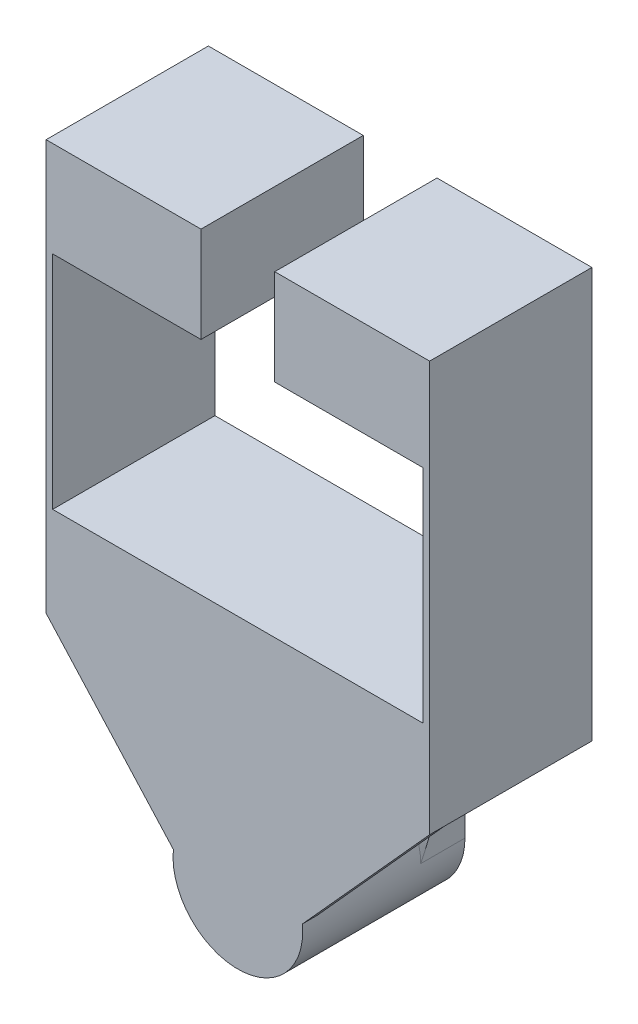
ISO-10303-21;
HEADER;
FILE_DESCRIPTION(('STEP AP214'),'2;1');
FILE_NAME('part.step','',(''),(''),'','','');
FILE_SCHEMA(('AUTOMOTIVE_DESIGN { 1 0 10303 214 1 1 1 1 }'));
ENDSEC;
DATA;
#1=APPLICATION_CONTEXT('core data for automotive mechanical design processes');
#2=APPLICATION_PROTOCOL_DEFINITION('international standard','automotive_design',2000,#1);
#3=PRODUCT_CONTEXT('',#1,'mechanical');
#4=PRODUCT('Part','Part','',(#3));
#5=PRODUCT_RELATED_PRODUCT_CATEGORY('part','',(#4));
#6=PRODUCT_DEFINITION_FORMATION('','',#4);
#7=PRODUCT_DEFINITION_CONTEXT('part definition',#1,'design');
#8=PRODUCT_DEFINITION('design','',#6,#7);
#9=PRODUCT_DEFINITION_SHAPE('','',#8);
#10=(LENGTH_UNIT() NAMED_UNIT(*) SI_UNIT(.MILLI.,.METRE.));
#11=(NAMED_UNIT(*) PLANE_ANGLE_UNIT() SI_UNIT($,.RADIAN.));
#12=(NAMED_UNIT(*) SI_UNIT($,.STERADIAN.) SOLID_ANGLE_UNIT());
#13=UNCERTAINTY_MEASURE_WITH_UNIT(LENGTH_MEASURE(1.E-05),#10,'distance_accuracy_value','');
#14=(GEOMETRIC_REPRESENTATION_CONTEXT(3) GLOBAL_UNCERTAINTY_ASSIGNED_CONTEXT((#13)) GLOBAL_UNIT_ASSIGNED_CONTEXT((#10,
#11,#12)) REPRESENTATION_CONTEXT('',''));
#15=CARTESIAN_POINT('',(0.,0.,0.));
#16=DIRECTION('',(0.,0.,1.));
#17=DIRECTION('',(1.,0.,0.));
#18=AXIS2_PLACEMENT_3D('',#15,#16,#17);
#19=CARTESIAN_POINT('',(0.,25.4,0.));
#20=DIRECTION('',(0.,-1.,0.));
#21=DIRECTION('',(0.,0.,-1.));
#22=AXIS2_PLACEMENT_3D('',#19,#20,#21);
#23=PLANE('',#22);
#24=DIRECTION('',(0.,0.,-1.));
#25=VECTOR('',#24,1.);
#26=CARTESIAN_POINT('',(33.02,25.4,0.));
#27=LINE('',#26,#25);
#28=CARTESIAN_POINT('',(33.02,25.4,-2.54));
#29=VERTEX_POINT('',#28);
#30=CARTESIAN_POINT('',(33.02,25.4,-27.94));
#31=VERTEX_POINT('',#30);
#32=EDGE_CURVE('E234',#29,#31,#27,.T.);
#33=ORIENTED_EDGE('',*,*,#32,.F.);
#34=DIRECTION('',(-1.,0.,0.));
#35=VECTOR('',#34,1.);
#36=CARTESIAN_POINT('',(33.02,25.4,-2.54));
#37=LINE('',#36,#35);
#38=CARTESIAN_POINT('',(-33.02,25.4,-2.54));
#39=VERTEX_POINT('',#38);
#40=EDGE_CURVE('E223',#29,#39,#37,.T.);
#41=ORIENTED_EDGE('',*,*,#40,.T.);
#42=DIRECTION('',(0.,0.,1.));
#43=VECTOR('',#42,1.);
#44=CARTESIAN_POINT('',(-33.02,25.4,0.));
#45=LINE('',#44,#43);
#46=CARTESIAN_POINT('',(-33.02,25.4,-27.94));
#47=VERTEX_POINT('',#46);
#48=EDGE_CURVE('E231',#47,#39,#45,.T.);
#49=ORIENTED_EDGE('',*,*,#48,.F.);
#50=DIRECTION('',(-1.,0.,0.));
#51=VECTOR('',#50,1.);
#52=CARTESIAN_POINT('',(-11.1628049548617,25.4,-27.94));
#53=LINE('',#52,#51);
#54=CARTESIAN_POINT('',(-11.1628049548617,25.4,-27.94));
#55=VERTEX_POINT('',#54);
#56=EDGE_CURVE('E413',#55,#47,#53,.T.);
#57=ORIENTED_EDGE('',*,*,#56,.F.);
#58=DIRECTION('',(0.,0.,-1.));
#59=VECTOR('',#58,1.);
#60=CARTESIAN_POINT('',(-11.1628049548617,25.4,-22.86));
#61=LINE('',#60,#59);
#62=CARTESIAN_POINT('',(-11.1628049548617,25.4,-13.97));
#63=VERTEX_POINT('',#62);
#64=EDGE_CURVE('E280',#63,#55,#61,.T.);
#65=ORIENTED_EDGE('',*,*,#64,.F.);
#66=DIRECTION('',(1.,0.,0.));
#67=VECTOR('',#66,1.);
#68=CARTESIAN_POINT('',(-33.02,25.4,-13.97));
#69=LINE('',#68,#67);
#70=CARTESIAN_POINT('',(11.1628049548617,25.4,-13.97));
#71=VERTEX_POINT('',#70);
#72=EDGE_CURVE('E393',#63,#71,#69,.T.);
#73=ORIENTED_EDGE('',*,*,#72,.T.);
#74=DIRECTION('',(0.,0.,-1.));
#75=VECTOR('',#74,1.);
#76=CARTESIAN_POINT('',(11.1628049548617,25.4,-22.86));
#77=LINE('',#76,#75);
#78=CARTESIAN_POINT('',(11.1628049548617,25.4,-27.94));
#79=VERTEX_POINT('',#78);
#80=EDGE_CURVE('E277',#71,#79,#77,.T.);
#81=ORIENTED_EDGE('',*,*,#80,.T.);
#82=DIRECTION('',(-1.,0.,0.));
#83=VECTOR('',#82,1.);
#84=CARTESIAN_POINT('',(33.02,25.4,-27.94));
#85=LINE('',#84,#83);
#86=EDGE_CURVE('E458',#31,#79,#85,.T.);
#87=ORIENTED_EDGE('',*,*,#86,.F.);
#88=EDGE_LOOP('',(#33,#41,#49,#57,#65,#73,#81,#87));
#89=FACE_BOUND('',#88,.T.);
#90=ADVANCED_FACE('F47',(#89),#23,.T.);
#91=CARTESIAN_POINT('',(0.,0.,-22.86));
#92=DIRECTION('',(0.,0.,-1.));
#93=DIRECTION('',(-1.,0.,0.));
#94=AXIS2_PLACEMENT_3D('',#91,#92,#93);
#95=PLANE('',#94);
#96=CARTESIAN_POINT('',(0.,0.,-22.86));
#97=DIRECTION('',(0.,0.,-1.));
#98=DIRECTION('',(-1.,0.,0.));
#99=AXIS2_PLACEMENT_3D('',#96,#97,#98);
#100=CIRCLE('',#99,13.7028049548617);
#101=CARTESIAN_POINT('',(-11.1628049548617,7.94724160767102,-22.86));
#102=VERTEX_POINT('',#101);
#103=CARTESIAN_POINT('',(-6.79504801211464,11.8993355337195,-22.86));
#104=VERTEX_POINT('',#103);
#105=EDGE_CURVE('E304',#102,#104,#100,.T.);
#106=ORIENTED_EDGE('',*,*,#105,.T.);
#107=DIRECTION('',(1.,0.,0.));
#108=VECTOR('',#107,1.);
#109=CARTESIAN_POINT('',(0.,11.8993355337195,-22.86));
#110=LINE('',#109,#108);
#111=CARTESIAN_POINT('',(-11.1628049548617,11.8993355337195,-22.86));
#112=VERTEX_POINT('',#111);
#113=EDGE_CURVE('E307',#104,#112,#110,.F.);
#114=ORIENTED_EDGE('',*,*,#113,.T.);
#115=DIRECTION('',(0.,1.,0.));
#116=VECTOR('',#115,1.);
#117=CARTESIAN_POINT('',(-11.1628049548617,25.4,-22.86));
#118=LINE('',#117,#116);
#119=EDGE_CURVE('E264',#102,#112,#118,.T.);
#120=ORIENTED_EDGE('',*,*,#119,.F.);
#121=EDGE_LOOP('',(#106,#114,#120));
#122=FACE_BOUND('',#121,.T.);
#123=ADVANCED_FACE('F356',(#122),#95,.F.);
#124=CARTESIAN_POINT('',(-33.02,41.4643705136554,0.));
#125=DIRECTION('',(1.,0.,0.));
#126=DIRECTION('',(0.,0.,-1.));
#127=AXIS2_PLACEMENT_3D('',#124,#125,#126);
#128=PLANE('',#127);
#129=ORIENTED_EDGE('',*,*,#48,.T.);
#130=DIRECTION('',(0.,0.,1.));
#131=VECTOR('',#130,1.);
#132=CARTESIAN_POINT('',(-33.02,25.4,-2.54));
#133=LINE('',#132,#131);
#134=CARTESIAN_POINT('',(-33.02,25.4,0.));
#135=VERTEX_POINT('',#134);
#136=EDGE_CURVE('E210',#39,#135,#133,.T.);
#137=ORIENTED_EDGE('',*,*,#136,.T.);
#138=DIRECTION('',(0.,-1.,0.));
#139=VECTOR('',#138,1.);
#140=CARTESIAN_POINT('',(-33.02,41.4643705136554,0.));
#141=LINE('',#140,#139);
#142=CARTESIAN_POINT('',(-33.02,96.0254518876114,0.));
#143=VERTEX_POINT('',#142);
#144=EDGE_CURVE('E261',#143,#135,#141,.T.);
#145=ORIENTED_EDGE('',*,*,#144,.F.);
#146=DIRECTION('',(0.,0.,1.));
#147=VECTOR('',#146,1.);
#148=CARTESIAN_POINT('',(-33.02,96.0254518876114,0.));
#149=LINE('',#148,#147);
#150=CARTESIAN_POINT('',(-33.02,96.0254518876114,-27.94));
#151=VERTEX_POINT('',#150);
#152=EDGE_CURVE('E470',#151,#143,#149,.T.);
#153=ORIENTED_EDGE('',*,*,#152,.F.);
#154=DIRECTION('',(0.,1.,0.));
#155=VECTOR('',#154,1.);
#156=CARTESIAN_POINT('',(-33.02,25.4,-27.94));
#157=LINE('',#156,#155);
#158=EDGE_CURVE('E242',#47,#151,#157,.T.);
#159=ORIENTED_EDGE('',*,*,#158,.F.);
#160=EDGE_LOOP('',(#129,#137,#145,#153,#159));
#161=FACE_BOUND('',#160,.T.);
#162=ADVANCED_FACE('F240',(#161),#128,.F.);
#163=CARTESIAN_POINT('',(0.,41.4643705136554,0.));
#164=DIRECTION('',(0.,-1.,0.));
#165=DIRECTION('',(0.,0.,-1.));
#166=AXIS2_PLACEMENT_3D('',#163,#164,#165);
#167=PLANE('',#166);
#168=DIRECTION('',(0.,0.,1.));
#169=VECTOR('',#168,1.);
#170=CARTESIAN_POINT('',(31.8903580164554,41.4643705136554,-25.4));
#171=LINE('',#170,#169);
#172=CARTESIAN_POINT('',(31.8903580164554,41.4643705136554,-27.94));
#173=VERTEX_POINT('',#172);
#174=CARTESIAN_POINT('',(31.8903580164554,41.4643705136554,0.));
#175=VERTEX_POINT('',#174);
#176=EDGE_CURVE('E513',#173,#175,#171,.T.);
#177=ORIENTED_EDGE('',*,*,#176,.F.);
#178=DIRECTION('',(1.,0.,0.));
#179=VECTOR('',#178,1.);
#180=CARTESIAN_POINT('',(-31.8903580164554,41.4643705136554,-27.94));
#181=LINE('',#180,#179);
#182=CARTESIAN_POINT('',(-31.8903580164554,41.4643705136554,-27.94));
#183=VERTEX_POINT('',#182);
#184=EDGE_CURVE('E434',#183,#173,#181,.T.);
#185=ORIENTED_EDGE('',*,*,#184,.F.);
#186=DIRECTION('',(0.,0.,-1.));
#187=VECTOR('',#186,1.);
#188=CARTESIAN_POINT('',(-31.8903580164554,41.4643705136554,-25.4));
#189=LINE('',#188,#187);
#190=CARTESIAN_POINT('',(-31.8903580164554,41.4643705136554,0.));
#191=VERTEX_POINT('',#190);
#192=EDGE_CURVE('E517',#191,#183,#189,.T.);
#193=ORIENTED_EDGE('',*,*,#192,.F.);
#194=DIRECTION('',(1.,0.,0.));
#195=VECTOR('',#194,1.);
#196=CARTESIAN_POINT('',(-33.02,41.4643705136554,0.));
#197=LINE('',#196,#195);
#198=EDGE_CURVE('E254',#191,#175,#197,.T.);
#199=ORIENTED_EDGE('',*,*,#198,.T.);
#200=EDGE_LOOP('',(#177,#185,#193,#199));
#201=FACE_BOUND('',#200,.T.);
#202=ADVANCED_FACE('F346',(#201),#167,.F.);
#203=CARTESIAN_POINT('',(0.,0.,-25.4));
#204=DIRECTION('',(0.,0.,1.));
#205=DIRECTION('',(1.,0.,0.));
#206=AXIS2_PLACEMENT_3D('',#203,#204,#205);
#207=CYLINDRICAL_SURFACE('',#206,11.1628049548617);
#208=DIRECTION('',(0.,0.,1.));
#209=VECTOR('',#208,1.);
#210=CARTESIAN_POINT('',(11.1050792058228,1.13376818295749,-2.54));
#211=LINE('',#210,#209);
#212=CARTESIAN_POINT('',(11.1050792058228,1.13376818295749,-2.54));
#213=VERTEX_POINT('',#212);
#214=CARTESIAN_POINT('',(11.1050792058228,1.13376818295749,0.));
#215=VERTEX_POINT('',#214);
#216=EDGE_CURVE('E399',#213,#215,#211,.T.);
#217=ORIENTED_EDGE('',*,*,#216,.T.);
#218=CARTESIAN_POINT('',(0.,0.,0.));
#219=DIRECTION('',(0.,0.,1.));
#220=DIRECTION('',(1.,0.,0.));
#221=AXIS2_PLACEMENT_3D('',#218,#219,#220);
#222=CIRCLE('',#221,11.1628049548617);
#223=CARTESIAN_POINT('',(-11.1050792058228,1.13376818295749,0.));
#224=VERTEX_POINT('',#223);
#225=EDGE_CURVE('E276',#224,#215,#222,.T.);
#226=ORIENTED_EDGE('',*,*,#225,.F.);
#227=DIRECTION('',(0.,0.,1.));
#228=VECTOR('',#227,1.);
#229=CARTESIAN_POINT('',(-11.1050792058228,1.1337681829575,-2.54));
#230=LINE('',#229,#228);
#231=CARTESIAN_POINT('',(-11.1050792058228,1.1337681829575,-2.54));
#232=VERTEX_POINT('',#231);
#233=EDGE_CURVE('E218',#232,#224,#230,.T.);
#234=ORIENTED_EDGE('',*,*,#233,.F.);
#235=CARTESIAN_POINT('',(0.,0.,-2.54));
#236=DIRECTION('',(0.,0.,1.));
#237=DIRECTION('',(1.,0.,0.));
#238=AXIS2_PLACEMENT_3D('',#235,#236,#237);
#239=CIRCLE('',#238,11.1628049548617);
#240=EDGE_CURVE('E226',#232,#213,#239,.F.);
#241=ORIENTED_EDGE('',*,*,#240,.T.);
#242=EDGE_LOOP('',(#217,#226,#234,#241));
#243=FACE_BOUND('',#242,.T.);
#244=CARTESIAN_POINT('',(0.,0.,-20.32));
#245=DIRECTION('',(0.,0.,-1.));
#246=DIRECTION('',(-1.,0.,0.));
#247=AXIS2_PLACEMENT_3D('',#244,#245,#246);
#248=CIRCLE('',#247,11.1628049548617);
#249=CARTESIAN_POINT('',(11.1628049548617,0.,-20.32));
#250=VERTEX_POINT('',#249);
#251=CARTESIAN_POINT('',(-11.1628049548617,0.,-20.32));
#252=VERTEX_POINT('',#251);
#253=EDGE_CURVE('E310',#250,#252,#248,.F.);
#254=ORIENTED_EDGE('',*,*,#253,.T.);
#255=DIRECTION('',(0.,0.,-1.));
#256=VECTOR('',#255,1.);
#257=CARTESIAN_POINT('',(-11.1628049548617,0.,-22.86));
#258=LINE('',#257,#256);
#259=CARTESIAN_POINT('',(-11.1628049548617,0.,-27.94));
#260=VERTEX_POINT('',#259);
#261=EDGE_CURVE('E272',#252,#260,#258,.T.);
#262=ORIENTED_EDGE('',*,*,#261,.T.);
#263=CARTESIAN_POINT('',(0.,0.,-27.94));
#264=DIRECTION('',(0.,0.,-1.));
#265=DIRECTION('',(-1.,0.,0.));
#266=AXIS2_PLACEMENT_3D('',#263,#264,#265);
#267=CIRCLE('',#266,11.1628049548617);
#268=CARTESIAN_POINT('',(11.1628049548617,0.,-27.94));
#269=VERTEX_POINT('',#268);
#270=EDGE_CURVE('E397',#269,#260,#267,.T.);
#271=ORIENTED_EDGE('',*,*,#270,.F.);
#272=DIRECTION('',(0.,0.,-1.));
#273=VECTOR('',#272,1.);
#274=CARTESIAN_POINT('',(11.1628049548617,0.,-22.86));
#275=LINE('',#274,#273);
#276=EDGE_CURVE('E273',#250,#269,#275,.T.);
#277=ORIENTED_EDGE('',*,*,#276,.F.);
#278=EDGE_LOOP('',(#254,#262,#271,#277));
#279=FACE_BOUND('',#278,.T.);
#280=ADVANCED_FACE('F343',(#243,#279),#207,.T.);
#281=CARTESIAN_POINT('',(0.,0.,0.));
#282=DIRECTION('',(0.,0.,1.));
#283=DIRECTION('',(1.,0.,0.));
#284=AXIS2_PLACEMENT_3D('',#281,#282,#283);
#285=PLANE('',#284);
#286=ORIENTED_EDGE('',*,*,#225,.T.);
#287=DIRECTION('',(0.670236300369095,0.742147762691197,0.));
#288=VECTOR('',#287,1.);
#289=CARTESIAN_POINT('',(11.1050792058228,1.13376818295749,0.));
#290=LINE('',#289,#288);
#291=CARTESIAN_POINT('',(33.02,25.4,0.));
#292=VERTEX_POINT('',#291);
#293=EDGE_CURVE('E237',#215,#292,#290,.T.);
#294=ORIENTED_EDGE('',*,*,#293,.T.);
#295=DIRECTION('',(0.,-1.,0.));
#296=VECTOR('',#295,1.);
#297=CARTESIAN_POINT('',(33.02,41.4643705136554,0.));
#298=LINE('',#297,#296);
#299=CARTESIAN_POINT('',(33.02,96.0254518876114,0.));
#300=VERTEX_POINT('',#299);
#301=EDGE_CURVE('E257',#300,#292,#298,.T.);
#302=ORIENTED_EDGE('',*,*,#301,.F.);
#303=DIRECTION('',(1.,0.,0.));
#304=VECTOR('',#303,1.);
#305=CARTESIAN_POINT('',(33.02,96.0254518876114,0.));
#306=LINE('',#305,#304);
#307=CARTESIAN_POINT('',(6.34999999999999,96.0254518876114,0.));
#308=VERTEX_POINT('',#307);
#309=EDGE_CURVE('E495',#308,#300,#306,.T.);
#310=ORIENTED_EDGE('',*,*,#309,.F.);
#311=DIRECTION('',(0.,-1.,0.));
#312=VECTOR('',#311,1.);
#313=CARTESIAN_POINT('',(6.34999999999999,96.0254518876114,0.));
#314=LINE('',#313,#312);
#315=CARTESIAN_POINT('',(6.34999999999999,79.5643705136554,0.));
#316=VERTEX_POINT('',#315);
#317=EDGE_CURVE('E499',#308,#316,#314,.T.);
#318=ORIENTED_EDGE('',*,*,#317,.T.);
#319=DIRECTION('',(1.,0.,0.));
#320=VECTOR('',#319,1.);
#321=CARTESIAN_POINT('',(33.02,79.5643705136554,0.));
#322=LINE('',#321,#320);
#323=CARTESIAN_POINT('',(31.8903580164554,79.5643705136554,0.));
#324=VERTEX_POINT('',#323);
#325=EDGE_CURVE('E492',#316,#324,#322,.T.);
#326=ORIENTED_EDGE('',*,*,#325,.T.);
#327=DIRECTION('',(0.,-1.,0.));
#328=VECTOR('',#327,1.);
#329=CARTESIAN_POINT('',(31.8903580164554,79.5643705136554,0.));
#330=LINE('',#329,#328);
#331=EDGE_CURVE('E508',#324,#175,#330,.T.);
#332=ORIENTED_EDGE('',*,*,#331,.T.);
#333=ORIENTED_EDGE('',*,*,#198,.F.);
#334=DIRECTION('',(0.,-1.,0.));
#335=VECTOR('',#334,1.);
#336=CARTESIAN_POINT('',(-31.8903580164554,79.5643705136554,0.));
#337=LINE('',#336,#335);
#338=CARTESIAN_POINT('',(-31.8903580164554,79.5643705136554,0.));
#339=VERTEX_POINT('',#338);
#340=EDGE_CURVE('E244',#339,#191,#337,.T.);
#341=ORIENTED_EDGE('',*,*,#340,.F.);
#342=DIRECTION('',(1.,0.,0.));
#343=VECTOR('',#342,1.);
#344=CARTESIAN_POINT('',(-33.02,79.5643705136554,0.));
#345=LINE('',#344,#343);
#346=CARTESIAN_POINT('',(-6.34999999999999,79.5643705136554,0.));
#347=VERTEX_POINT('',#346);
#348=EDGE_CURVE('E474',#339,#347,#345,.T.);
#349=ORIENTED_EDGE('',*,*,#348,.T.);
#350=DIRECTION('',(0.,-1.,0.));
#351=VECTOR('',#350,1.);
#352=CARTESIAN_POINT('',(-6.34999999999999,96.0254518876114,0.));
#353=LINE('',#352,#351);
#354=CARTESIAN_POINT('',(-6.34999999999999,96.0254518876114,0.));
#355=VERTEX_POINT('',#354);
#356=EDGE_CURVE('E466',#355,#347,#353,.T.);
#357=ORIENTED_EDGE('',*,*,#356,.F.);
#358=DIRECTION('',(1.,0.,0.));
#359=VECTOR('',#358,1.);
#360=CARTESIAN_POINT('',(-33.02,96.0254518876114,0.));
#361=LINE('',#360,#359);
#362=EDGE_CURVE('E475',#143,#355,#361,.T.);
#363=ORIENTED_EDGE('',*,*,#362,.F.);
#364=ORIENTED_EDGE('',*,*,#144,.T.);
#365=DIRECTION('',(0.670236300369095,-0.742147762691196,0.));
#366=VECTOR('',#365,1.);
#367=CARTESIAN_POINT('',(-33.02,25.4,0.));
#368=LINE('',#367,#366);
#369=EDGE_CURVE('E69',#135,#224,#368,.T.);
#370=ORIENTED_EDGE('',*,*,#369,.T.);
#371=EDGE_LOOP('',(#286,#294,#302,#310,#318,#326,#332,#333,#341,#349,#357,#363,#364,#370));
#372=FACE_BOUND('',#371,.T.);
#373=ADVANCED_FACE('F345',(#372),#285,.T.);
#374=CARTESIAN_POINT('',(11.1628049548617,0.,-22.86));
#375=DIRECTION('',(1.,0.,0.));
#376=DIRECTION('',(0.,1.,0.));
#377=AXIS2_PLACEMENT_3D('',#374,#375,#376);
#378=PLANE('',#377);
#379=ORIENTED_EDGE('',*,*,#276,.T.);
#380=DIRECTION('',(0.,-1.,0.));
#381=VECTOR('',#380,1.);
#382=CARTESIAN_POINT('',(11.1628049548617,25.4,-27.94));
#383=LINE('',#382,#381);
#384=EDGE_CURVE('E462',#79,#269,#383,.T.);
#385=ORIENTED_EDGE('',*,*,#384,.F.);
#386=ORIENTED_EDGE('',*,*,#80,.F.);
#387=DIRECTION('',(0.,-0.819231920519041,-0.573462344363328));
#388=VECTOR('',#387,1.);
#389=CARTESIAN_POINT('',(11.1628049548617,25.4,-13.97));
#390=LINE('',#389,#388);
#391=CARTESIAN_POINT('',(11.1628049548617,13.3559298884023,-22.4008490781184));
#392=VERTEX_POINT('',#391);
#393=EDGE_CURVE('E287',#71,#392,#390,.T.);
#394=ORIENTED_EDGE('',*,*,#393,.T.);
#395=CARTESIAN_POINT('',(11.1628049548617,11.8993355337195,-20.32));
#396=DIRECTION('',(1.,0.,0.));
#397=DIRECTION('',(0.,1.,0.));
#398=AXIS2_PLACEMENT_3D('',#395,#396,#397);
#399=CIRCLE('',#398,2.54);
#400=CARTESIAN_POINT('',(11.1628049548617,11.8993355337195,-22.86));
#401=VERTEX_POINT('',#400);
#402=EDGE_CURVE('E314',#392,#401,#399,.F.);
#403=ORIENTED_EDGE('',*,*,#402,.T.);
#404=DIRECTION('',(0.,-1.,0.));
#405=VECTOR('',#404,1.);
#406=CARTESIAN_POINT('',(11.1628049548617,0.,-22.86));
#407=LINE('',#406,#405);
#408=CARTESIAN_POINT('',(11.1628049548617,7.94724160767102,-22.86));
#409=VERTEX_POINT('',#408);
#410=EDGE_CURVE('E268',#401,#409,#407,.T.);
#411=ORIENTED_EDGE('',*,*,#410,.T.);
#412=CARTESIAN_POINT('',(11.1628049548617,7.94724160767102,-22.86));
#413=CARTESIAN_POINT('',(11.1628049548617,7.80382728075797,-22.8599843683913));
#414=CARTESIAN_POINT('',(11.1628049548617,7.66045711121722,-22.8559154067964));
#415=CARTESIAN_POINT('',(11.1628049548617,7.374189907598,-22.8404396048927));
#416=CARTESIAN_POINT('',(11.1628049548617,7.23129264831364,-22.8290369984348));
#417=CARTESIAN_POINT('',(11.1628049548617,6.94660398988748,-22.799703566714));
#418=CARTESIAN_POINT('',(11.1628049548617,6.80481058426645,-22.7817917990212));
#419=CARTESIAN_POINT('',(11.1628049548617,6.52207951337565,-22.7400890787699));
#420=CARTESIAN_POINT('',(11.1628049548617,6.38114198769657,-22.7162971922434));
#421=CARTESIAN_POINT('',(11.1628049548617,5.96327763477642,-22.6376625928827));
#422=CARTESIAN_POINT('',(11.1628049548617,5.68777633607782,-22.5751665055497));
#423=CARTESIAN_POINT('',(11.1628049548617,5.1409442882879,-22.4335544124404));
#424=CARTESIAN_POINT('',(11.1628049548617,4.86961729830888,-22.3544242711608));
#425=CARTESIAN_POINT('',(11.1628049548617,4.20575637726897,-22.1429551839701));
#426=CARTESIAN_POINT('',(11.1628049548617,3.81566212496473,-22.0030048054641));
#427=CARTESIAN_POINT('',(11.1628049548617,3.04328881541315,-21.703390763083));
#428=CARTESIAN_POINT('',(11.1628049548617,2.6610101188809,-21.5437261917128));
#429=CARTESIAN_POINT('',(11.1628049548617,1.51983320538655,-21.0449283894831));
#430=CARTESIAN_POINT('',(11.1628049548616,0.769317138766279,-20.6869738266354));
#431=CARTESIAN_POINT('',(11.1628049548617,0.0127147230288613,-20.3260650733986));
#432=CARTESIAN_POINT('',(11.1628049548617,0.00635735509335308,-20.3230325262451));
#433=CARTESIAN_POINT('',(11.1628049548617,0.,-20.32));
#434=B_SPLINE_CURVE_WITH_KNOTS('',3,(#412,#413,#414,#415,#416,#417,#418,#419,#420,#421,#422,
#423,#424,#425,#426,#427,#428,#429,#430,#431,#432,#433),.UNSPECIFIED.,.F.,.F.,(4,2,2,2,2,2,2,2,
2,2,4),(0.,0.430121960835827,0.859995826814775,1.2886211134076,1.71731452444488,
2.56409625718893,3.41160050938489,4.65405351827766,5.89656374183366,8.39024598854829,
8.41137682379432),.UNSPECIFIED.);
#435=EDGE_CURVE('E11',#409,#250,#434,.T.);
#436=ORIENTED_EDGE('',*,*,#435,.T.);
#437=EDGE_LOOP('',(#379,#385,#386,#394,#403,#411,#436));
#438=FACE_BOUND('',#437,.T.);
#439=ADVANCED_FACE('F349',(#438),#378,.T.);
#440=CARTESIAN_POINT('',(-11.1628049548617,25.4,-22.86));
#441=DIRECTION('',(-1.,0.,0.));
#442=DIRECTION('',(0.,0.,1.));
#443=AXIS2_PLACEMENT_3D('',#440,#441,#442);
#444=PLANE('',#443);
#445=ORIENTED_EDGE('',*,*,#64,.T.);
#446=DIRECTION('',(0.,1.,0.));
#447=VECTOR('',#446,1.);
#448=CARTESIAN_POINT('',(-11.1628049548617,0.,-27.94));
#449=LINE('',#448,#447);
#450=EDGE_CURVE('E409',#260,#55,#449,.T.);
#451=ORIENTED_EDGE('',*,*,#450,.F.);
#452=ORIENTED_EDGE('',*,*,#261,.F.);
#453=CARTESIAN_POINT('',(-11.1628049548617,7.94724160767102,-22.86));
#454=CARTESIAN_POINT('',(-11.1628049548617,7.80382728075855,-22.8599843683913));
#455=CARTESIAN_POINT('',(-11.1628049548617,7.66045711121839,-22.8559154067964));
#456=CARTESIAN_POINT('',(-11.1628049548617,7.37418990760035,-22.8404396048929));
#457=CARTESIAN_POINT('',(-11.1628049548617,7.23129264831658,-22.829036998435));
#458=CARTESIAN_POINT('',(-11.1628049548617,6.94660398989145,-22.7997035667144));
#459=CARTESIAN_POINT('',(-11.1628049548617,6.80481058427088,-22.7817917990218));
#460=CARTESIAN_POINT('',(-11.1628049548617,6.52207951338097,-22.7400890787707));
#461=CARTESIAN_POINT('',(-11.1628049548617,6.38114198770233,-22.7162971922444));
#462=CARTESIAN_POINT('',(-11.1628049548617,5.96327763478148,-22.6376625928838));
#463=CARTESIAN_POINT('',(-11.1628049548617,5.68777633608175,-22.5751665055507));
#464=CARTESIAN_POINT('',(-11.1628049548617,5.1409442882898,-22.4335544124409));
#465=CARTESIAN_POINT('',(-11.1628049548617,4.86961729830987,-22.3544242711609));
#466=CARTESIAN_POINT('',(-11.1628049548617,4.20575637726872,-22.1429551839702));
#467=CARTESIAN_POINT('',(-11.1628049548617,3.81566212496399,-22.0030048054649));
#468=CARTESIAN_POINT('',(-11.1628049548617,3.04328881541282,-21.7033907630818));
#469=CARTESIAN_POINT('',(-11.1628049548617,2.66101011888147,-21.5437261917086));
#470=CARTESIAN_POINT('',(-11.1628049548617,1.51983320538202,-21.04492838949));
#471=CARTESIAN_POINT('',(-11.1628049548617,0.769317138746502,-20.6869738266757));
#472=CARTESIAN_POINT('',(-11.1628049548617,0.0127147230285586,-20.3260650733992));
#473=CARTESIAN_POINT('',(-11.1628049548617,0.00635735509320121,-20.3230325262454));
#474=CARTESIAN_POINT('',(-11.1628049548617,0.,-20.32));
#475=B_SPLINE_CURVE_WITH_KNOTS('',3,(#453,#454,#455,#456,#457,#458,#459,#460,#461,#462,#463,
#464,#465,#466,#467,#468,#469,#470,#471,#472,#473,#474),.UNSPECIFIED.,.F.,.F.,(4,2,2,2,2,2,2,2,
2,2,4),(0.,0.430121960834059,0.859995826811239,1.28862111340268,1.71731452443857,
2.56409625718598,3.4116005093849,4.6540535182781,5.89656374183534,8.39024598854825,
8.41137682379433),.UNSPECIFIED.);
#476=EDGE_CURVE('E62',#252,#102,#475,.F.);
#477=ORIENTED_EDGE('',*,*,#476,.T.);
#478=ORIENTED_EDGE('',*,*,#119,.T.);
#479=CARTESIAN_POINT('',(-11.1628049548617,11.8993355337195,-20.32));
#480=DIRECTION('',(-1.,0.,0.));
#481=DIRECTION('',(0.,0.,1.));
#482=AXIS2_PLACEMENT_3D('',#479,#480,#481);
#483=CIRCLE('',#482,2.54);
#484=CARTESIAN_POINT('',(-11.1628049548617,13.3559298884023,-22.4008490781184));
#485=VERTEX_POINT('',#484);
#486=EDGE_CURVE('E317',#112,#485,#483,.F.);
#487=ORIENTED_EDGE('',*,*,#486,.T.);
#488=DIRECTION('',(0.,0.819231920519041,0.573462344363328));
#489=VECTOR('',#488,1.);
#490=CARTESIAN_POINT('',(-11.1628049548617,25.4,-13.97));
#491=LINE('',#490,#489);
#492=EDGE_CURVE('E291',#485,#63,#491,.T.);
#493=ORIENTED_EDGE('',*,*,#492,.T.);
#494=EDGE_LOOP('',(#445,#451,#452,#477,#478,#487,#493));
#495=FACE_BOUND('',#494,.T.);
#496=ADVANCED_FACE('F331',(#495),#444,.T.);
#497=ORIENTED_EDGE('',*,*,#410,.F.);
#498=DIRECTION('',(1.,0.,0.));
#499=VECTOR('',#498,1.);
#500=CARTESIAN_POINT('',(0.,11.8993355337195,-22.86));
#501=LINE('',#500,#499);
#502=CARTESIAN_POINT('',(6.79504801211463,11.8993355337195,-22.86));
#503=VERTEX_POINT('',#502);
#504=EDGE_CURVE('E301',#401,#503,#501,.F.);
#505=ORIENTED_EDGE('',*,*,#504,.T.);
#506=CARTESIAN_POINT('',(0.,0.,-22.86));
#507=DIRECTION('',(0.,0.,-1.));
#508=DIRECTION('',(-1.,0.,0.));
#509=AXIS2_PLACEMENT_3D('',#506,#507,#508);
#510=CIRCLE('',#509,13.7028049548617);
#511=EDGE_CURVE('E298',#503,#409,#510,.T.);
#512=ORIENTED_EDGE('',*,*,#511,.T.);
#513=EDGE_LOOP('',(#497,#505,#512));
#514=FACE_BOUND('',#513,.T.);
#515=ADVANCED_FACE('F365',(#514),#95,.F.);
#516=CARTESIAN_POINT('',(33.02,41.4643705136554,0.));
#517=DIRECTION('',(-1.,0.,0.));
#518=DIRECTION('',(0.,0.,1.));
#519=AXIS2_PLACEMENT_3D('',#516,#517,#518);
#520=PLANE('',#519);
#521=EDGE_CURVE('E248',#292,#29,#27,.T.);
#522=ORIENTED_EDGE('',*,*,#521,.T.);
#523=ORIENTED_EDGE('',*,*,#32,.T.);
#524=DIRECTION('',(0.,-1.,0.));
#525=VECTOR('',#524,1.);
#526=CARTESIAN_POINT('',(33.02,96.0254518876114,-27.94));
#527=LINE('',#526,#525);
#528=CARTESIAN_POINT('',(33.02,96.0254518876114,-27.94));
#529=VERTEX_POINT('',#528);
#530=EDGE_CURVE('E454',#529,#31,#527,.T.);
#531=ORIENTED_EDGE('',*,*,#530,.F.);
#532=DIRECTION('',(0.,0.,-1.));
#533=VECTOR('',#532,1.);
#534=CARTESIAN_POINT('',(33.02,96.0254518876114,0.));
#535=LINE('',#534,#533);
#536=EDGE_CURVE('E488',#300,#529,#535,.T.);
#537=ORIENTED_EDGE('',*,*,#536,.F.);
#538=ORIENTED_EDGE('',*,*,#301,.T.);
#539=EDGE_LOOP('',(#522,#523,#531,#537,#538));
#540=FACE_BOUND('',#539,.T.);
#541=ADVANCED_FACE('F369',(#540),#520,.F.);
#542=CARTESIAN_POINT('',(-31.8903580164554,79.5643705136554,-25.4));
#543=DIRECTION('',(-1.,0.,0.));
#544=DIRECTION('',(0.,0.,1.));
#545=AXIS2_PLACEMENT_3D('',#542,#543,#544);
#546=PLANE('',#545);
#547=ORIENTED_EDGE('',*,*,#192,.T.);
#548=DIRECTION('',(0.,-1.,0.));
#549=VECTOR('',#548,1.);
#550=CARTESIAN_POINT('',(-31.8903580164554,79.5643705136554,-27.94));
#551=LINE('',#550,#549);
#552=CARTESIAN_POINT('',(-31.8903580164554,79.5643705136554,-27.94));
#553=VERTEX_POINT('',#552);
#554=EDGE_CURVE('E430',#553,#183,#551,.T.);
#555=ORIENTED_EDGE('',*,*,#554,.F.);
#556=DIRECTION('',(0.,0.,-1.));
#557=VECTOR('',#556,1.);
#558=CARTESIAN_POINT('',(-31.8903580164554,79.5643705136554,-25.4));
#559=LINE('',#558,#557);
#560=EDGE_CURVE('E251',#339,#553,#559,.T.);
#561=ORIENTED_EDGE('',*,*,#560,.F.);
#562=ORIENTED_EDGE('',*,*,#340,.T.);
#563=EDGE_LOOP('',(#547,#555,#561,#562));
#564=FACE_BOUND('',#563,.T.);
#565=ADVANCED_FACE('F371',(#564),#546,.F.);
#566=CARTESIAN_POINT('',(31.8903580164554,79.5643705136554,-25.4));
#567=DIRECTION('',(1.,0.,0.));
#568=DIRECTION('',(0.,0.,-1.));
#569=AXIS2_PLACEMENT_3D('',#566,#567,#568);
#570=PLANE('',#569);
#571=ORIENTED_EDGE('',*,*,#176,.T.);
#572=ORIENTED_EDGE('',*,*,#331,.F.);
#573=DIRECTION('',(0.,0.,1.));
#574=VECTOR('',#573,1.);
#575=CARTESIAN_POINT('',(31.8903580164554,79.5643705136554,-25.4));
#576=LINE('',#575,#574);
#577=CARTESIAN_POINT('',(31.8903580164554,79.5643705136554,-27.94));
#578=VERTEX_POINT('',#577);
#579=EDGE_CURVE('E512',#578,#324,#576,.T.);
#580=ORIENTED_EDGE('',*,*,#579,.F.);
#581=DIRECTION('',(0.,1.,0.));
#582=VECTOR('',#581,1.);
#583=CARTESIAN_POINT('',(31.8903580164554,41.4643705136554,-27.94));
#584=LINE('',#583,#582);
#585=EDGE_CURVE('E438',#173,#578,#584,.T.);
#586=ORIENTED_EDGE('',*,*,#585,.F.);
#587=EDGE_LOOP('',(#571,#572,#580,#586));
#588=FACE_BOUND('',#587,.T.);
#589=ADVANCED_FACE('F535',(#588),#570,.F.);
#590=CARTESIAN_POINT('',(0.,79.5643705136554,0.));
#591=DIRECTION('',(0.,1.,0.));
#592=DIRECTION('',(0.,0.,1.));
#593=AXIS2_PLACEMENT_3D('',#590,#591,#592);
#594=PLANE('',#593);
#595=DIRECTION('',(0.,0.,1.));
#596=VECTOR('',#595,1.);
#597=CARTESIAN_POINT('',(6.34999999999999,79.5643705136554,0.));
#598=LINE('',#597,#596);
#599=CARTESIAN_POINT('',(6.34999999999999,79.5643705136554,-27.94));
#600=VERTEX_POINT('',#599);
#601=EDGE_CURVE('E478',#600,#316,#598,.T.);
#602=ORIENTED_EDGE('',*,*,#601,.F.);
#603=DIRECTION('',(-1.,0.,0.));
#604=VECTOR('',#603,1.);
#605=CARTESIAN_POINT('',(31.8903580164554,79.5643705136554,-27.94));
#606=LINE('',#605,#604);
#607=EDGE_CURVE('E442',#578,#600,#606,.T.);
#608=ORIENTED_EDGE('',*,*,#607,.F.);
#609=ORIENTED_EDGE('',*,*,#579,.T.);
#610=ORIENTED_EDGE('',*,*,#325,.F.);
#611=EDGE_LOOP('',(#602,#608,#609,#610));
#612=FACE_BOUND('',#611,.T.);
#613=ADVANCED_FACE('F540',(#612),#594,.F.);
#614=CARTESIAN_POINT('',(6.34999999999999,96.0254518876114,0.));
#615=DIRECTION('',(1.,0.,0.));
#616=DIRECTION('',(0.,0.,-1.));
#617=AXIS2_PLACEMENT_3D('',#614,#615,#616);
#618=PLANE('',#617);
#619=ORIENTED_EDGE('',*,*,#601,.T.);
#620=ORIENTED_EDGE('',*,*,#317,.F.);
#621=DIRECTION('',(0.,0.,1.));
#622=VECTOR('',#621,1.);
#623=CARTESIAN_POINT('',(6.34999999999999,96.0254518876114,0.));
#624=LINE('',#623,#622);
#625=CARTESIAN_POINT('',(6.34999999999999,96.0254518876114,-27.94));
#626=VERTEX_POINT('',#625);
#627=EDGE_CURVE('E491',#626,#308,#624,.T.);
#628=ORIENTED_EDGE('',*,*,#627,.F.);
#629=DIRECTION('',(0.,1.,0.));
#630=VECTOR('',#629,1.);
#631=CARTESIAN_POINT('',(6.34999999999999,79.5643705136554,-27.94));
#632=LINE('',#631,#630);
#633=EDGE_CURVE('E446',#600,#626,#632,.T.);
#634=ORIENTED_EDGE('',*,*,#633,.F.);
#635=EDGE_LOOP('',(#619,#620,#628,#634));
#636=FACE_BOUND('',#635,.T.);
#637=ADVANCED_FACE('F545',(#636),#618,.F.);
#638=CARTESIAN_POINT('',(0.,96.0254518876114,0.));
#639=DIRECTION('',(0.,1.,0.));
#640=DIRECTION('',(0.,0.,1.));
#641=AXIS2_PLACEMENT_3D('',#638,#639,#640);
#642=PLANE('',#641);
#643=ORIENTED_EDGE('',*,*,#536,.T.);
#644=DIRECTION('',(1.,0.,0.));
#645=VECTOR('',#644,1.);
#646=CARTESIAN_POINT('',(6.34999999999999,96.0254518876114,-27.94));
#647=LINE('',#646,#645);
#648=EDGE_CURVE('E450',#626,#529,#647,.T.);
#649=ORIENTED_EDGE('',*,*,#648,.F.);
#650=ORIENTED_EDGE('',*,*,#627,.T.);
#651=ORIENTED_EDGE('',*,*,#309,.T.);
#652=EDGE_LOOP('',(#643,#649,#650,#651));
#653=FACE_BOUND('',#652,.T.);
#654=ADVANCED_FACE('F547',(#653),#642,.T.);
#655=CARTESIAN_POINT('',(0.,79.5643705136554,0.));
#656=DIRECTION('',(0.,1.,0.));
#657=DIRECTION('',(0.,0.,1.));
#658=AXIS2_PLACEMENT_3D('',#655,#656,#657);
#659=PLANE('',#658);
#660=ORIENTED_EDGE('',*,*,#348,.F.);
#661=ORIENTED_EDGE('',*,*,#560,.T.);
#662=DIRECTION('',(-1.,0.,0.));
#663=VECTOR('',#662,1.);
#664=CARTESIAN_POINT('',(-6.34999999999999,79.5643705136554,-27.94));
#665=LINE('',#664,#663);
#666=CARTESIAN_POINT('',(-6.34999999999999,79.5643705136554,-27.94));
#667=VERTEX_POINT('',#666);
#668=EDGE_CURVE('E426',#667,#553,#665,.T.);
#669=ORIENTED_EDGE('',*,*,#668,.F.);
#670=DIRECTION('',(0.,0.,-1.));
#671=VECTOR('',#670,1.);
#672=CARTESIAN_POINT('',(-6.34999999999999,79.5643705136554,0.));
#673=LINE('',#672,#671);
#674=EDGE_CURVE('E471',#347,#667,#673,.T.);
#675=ORIENTED_EDGE('',*,*,#674,.F.);
#676=EDGE_LOOP('',(#660,#661,#669,#675));
#677=FACE_BOUND('',#676,.T.);
#678=ADVANCED_FACE('F583',(#677),#659,.F.);
#679=CARTESIAN_POINT('',(-6.34999999999999,96.0254518876114,0.));
#680=DIRECTION('',(-1.,0.,0.));
#681=DIRECTION('',(0.,0.,1.));
#682=AXIS2_PLACEMENT_3D('',#679,#680,#681);
#683=PLANE('',#682);
#684=ORIENTED_EDGE('',*,*,#674,.T.);
#685=DIRECTION('',(0.,-1.,0.));
#686=VECTOR('',#685,1.);
#687=CARTESIAN_POINT('',(-6.34999999999999,96.0254518876114,-27.94));
#688=LINE('',#687,#686);
#689=CARTESIAN_POINT('',(-6.34999999999999,96.0254518876114,-27.94));
#690=VERTEX_POINT('',#689);
#691=EDGE_CURVE('E422',#690,#667,#688,.T.);
#692=ORIENTED_EDGE('',*,*,#691,.F.);
#693=DIRECTION('',(0.,0.,-1.));
#694=VECTOR('',#693,1.);
#695=CARTESIAN_POINT('',(-6.34999999999999,96.0254518876114,0.));
#696=LINE('',#695,#694);
#697=EDGE_CURVE('E482',#355,#690,#696,.T.);
#698=ORIENTED_EDGE('',*,*,#697,.F.);
#699=ORIENTED_EDGE('',*,*,#356,.T.);
#700=EDGE_LOOP('',(#684,#692,#698,#699));
#701=FACE_BOUND('',#700,.T.);
#702=ADVANCED_FACE('F579',(#701),#683,.F.);
#703=CARTESIAN_POINT('',(0.,96.0254518876114,0.));
#704=DIRECTION('',(0.,1.,0.));
#705=DIRECTION('',(0.,0.,1.));
#706=AXIS2_PLACEMENT_3D('',#703,#704,#705);
#707=PLANE('',#706);
#708=ORIENTED_EDGE('',*,*,#362,.T.);
#709=ORIENTED_EDGE('',*,*,#697,.T.);
#710=DIRECTION('',(1.,0.,0.));
#711=VECTOR('',#710,1.);
#712=CARTESIAN_POINT('',(-33.02,96.0254518876114,-27.94));
#713=LINE('',#712,#711);
#714=EDGE_CURVE('E418',#151,#690,#713,.T.);
#715=ORIENTED_EDGE('',*,*,#714,.F.);
#716=ORIENTED_EDGE('',*,*,#152,.T.);
#717=EDGE_LOOP('',(#708,#709,#715,#716));
#718=FACE_BOUND('',#717,.T.);
#719=ADVANCED_FACE('F575',(#718),#707,.T.);
#720=CARTESIAN_POINT('',(0.,0.,-27.94));
#721=DIRECTION('',(0.,0.,-1.));
#722=DIRECTION('',(-1.,0.,0.));
#723=AXIS2_PLACEMENT_3D('',#720,#721,#722);
#724=PLANE('',#723);
#725=ORIENTED_EDGE('',*,*,#270,.T.);
#726=ORIENTED_EDGE('',*,*,#450,.T.);
#727=ORIENTED_EDGE('',*,*,#56,.T.);
#728=ORIENTED_EDGE('',*,*,#158,.T.);
#729=ORIENTED_EDGE('',*,*,#714,.T.);
#730=ORIENTED_EDGE('',*,*,#691,.T.);
#731=ORIENTED_EDGE('',*,*,#668,.T.);
#732=ORIENTED_EDGE('',*,*,#554,.T.);
#733=ORIENTED_EDGE('',*,*,#184,.T.);
#734=ORIENTED_EDGE('',*,*,#585,.T.);
#735=ORIENTED_EDGE('',*,*,#607,.T.);
#736=ORIENTED_EDGE('',*,*,#633,.T.);
#737=ORIENTED_EDGE('',*,*,#648,.T.);
#738=ORIENTED_EDGE('',*,*,#530,.T.);
#739=ORIENTED_EDGE('',*,*,#86,.T.);
#740=ORIENTED_EDGE('',*,*,#384,.T.);
#741=EDGE_LOOP('',(#725,#726,#727,#728,#729,#730,#731,#732,#733,#734,#735,#736,#737,#738,#739,#740));
#742=FACE_BOUND('',#741,.T.);
#743=ADVANCED_FACE('F531',(#742),#724,.T.);
#744=CARTESIAN_POINT('',(-33.02,25.4,-13.97));
#745=DIRECTION('',(0.,-0.573462344363328,0.81923192051904));
#746=DIRECTION('',(0.,-0.81923192051904,-0.573462344363328));
#747=AXIS2_PLACEMENT_3D('',#744,#745,#746);
#748=PLANE('',#747);
#749=ORIENTED_EDGE('',*,*,#492,.F.);
#750=DIRECTION('',(1.,0.,0.));
#751=VECTOR('',#750,1.);
#752=CARTESIAN_POINT('',(-33.02,13.3559298884023,-22.4008490781184));
#753=LINE('',#752,#751);
#754=EDGE_CURVE('E294',#485,#392,#753,.T.);
#755=ORIENTED_EDGE('',*,*,#754,.T.);
#756=ORIENTED_EDGE('',*,*,#393,.F.);
#757=ORIENTED_EDGE('',*,*,#72,.F.);
#758=EDGE_LOOP('',(#749,#755,#756,#757));
#759=FACE_BOUND('',#758,.T.);
#760=ADVANCED_FACE('F337',(#759),#748,.T.);
#761=CARTESIAN_POINT('',(0.,0.,-20.32));
#762=DIRECTION('',(0.,0.,-1.));
#763=DIRECTION('',(-1.,0.,0.));
#764=AXIS2_PLACEMENT_3D('',#761,#762,#763);
#765=TOROIDAL_SURFACE('',#764,13.7028049548617,2.54);
#766=ORIENTED_EDGE('',*,*,#435,.F.);
#767=ORIENTED_EDGE('',*,*,#511,.F.);
#768=CARTESIAN_POINT('',(6.79504801211464,11.8993355337195,-22.86));
#769=CARTESIAN_POINT('',(6.79043641103554,11.900559497096,-22.8599999937344));
#770=CARTESIAN_POINT('',(6.78582449283145,11.9017822973788,-22.8599991091836));
#771=CARTESIAN_POINT('',(6.36979901745715,12.0119744221137,-22.8598405161195));
#772=CARTESIAN_POINT('',(5.95586867003918,12.1116853988487,-22.8527320665455));
#773=CARTESIAN_POINT('',(5.12393487514933,12.2917072161629,-22.8311465859493));
#774=CARTESIAN_POINT('',(4.70593011281786,12.3720115627912,-22.8166670934101));
#775=CARTESIAN_POINT('',(3.86603843398858,12.5126240306975,-22.7859008977493));
#776=CARTESIAN_POINT('',(3.44414701211468,12.5729048175022,-22.7696117643831));
#777=CARTESIAN_POINT('',(2.59781872293093,12.6727679183422,-22.73994531711));
#778=CARTESIAN_POINT('',(2.17338196608495,12.7123511241411,-22.7265678777661));
#779=CARTESIAN_POINT('',(1.39012754735451,12.7658339768625,-22.7077685043151));
#780=CARTESIAN_POINT('',(1.03154031163706,12.7828039715888,-22.7014234131092));
#781=CARTESIAN_POINT('',(0.313883065137136,12.8016606114869,-22.6943458748672));
#782=CARTESIAN_POINT('',(-0.0451869749209505,12.8035462965439,-22.693613785098));
#783=CARTESIAN_POINT('',(-0.763256057991137,12.7922121076074,-22.6978993529472));
#784=CARTESIAN_POINT('',(-1.12225494288787,12.7789835918933,-22.7029202999361));
#785=CARTESIAN_POINT('',(-1.83926873124928,12.7375134488421,-22.7178195944168));
#786=CARTESIAN_POINT('',(-2.19728365427696,12.7092721221902,-22.7276978446235));
#787=CARTESIAN_POINT('',(-2.91127578334393,12.638032452797,-22.7504975095891));
#788=CARTESIAN_POINT('',(-3.26725499875511,12.5950528827434,-22.7634150465498));
#789=CARTESIAN_POINT('',(-3.97717131586068,12.4946137304486,-22.7898049262462));
#790=CARTESIAN_POINT('',(-4.33110824667932,12.4371529540474,-22.8032773146598));
#791=CARTESIAN_POINT('',(-5.03618586152268,12.3081627030134,-22.8277410208647));
#792=CARTESIAN_POINT('',(-5.3873286252033,12.23664496165,-22.8387343915564));
#793=CARTESIAN_POINT('',(-6.08664422403011,12.0799384373476,-22.8547957425641));
#794=CARTESIAN_POINT('',(-6.43481776721887,11.9947530153936,-22.8598651770884));
#795=CARTESIAN_POINT('',(-6.78582449189416,11.9017822973028,-22.8599991108429));
#796=CARTESIAN_POINT('',(-6.79043641010579,11.9005594970136,-22.8599999954147));
#797=CARTESIAN_POINT('',(-6.79504801211464,11.8993355337195,-22.86));
#798=B_SPLINE_CURVE_WITH_KNOTS('',3,(#768,#769,#770,#771,#772,#773,#774,#775,#776,#777,#778,
#779,#780,#781,#782,#783,#784,#785,#786,#787,#788,#789,#790,#791,#792,#793,#794,#795,#796,#797),
.UNSPECIFIED.,.F.,.F.,(4,2,2,2,2,2,2,2,2,2,2,2,2,2,4),(0.,0.0143138133052843,1.29111191438751,
2.56833667474152,3.84729789692698,5.12620401001598,6.20299435415472,7.27985323534537,
8.35732813141681,9.43478144801472,10.5108674359873,11.5870421900273,12.6623224528273,
13.7373387002782,13.751652513585),.UNSPECIFIED.);
#799=EDGE_CURVE('E51',#104,#503,#798,.F.);
#800=ORIENTED_EDGE('',*,*,#799,.F.);
#801=ORIENTED_EDGE('',*,*,#105,.F.);
#802=ORIENTED_EDGE('',*,*,#476,.F.);
#803=ORIENTED_EDGE('',*,*,#253,.F.);
#804=EDGE_LOOP('',(#766,#767,#800,#801,#802,#803));
#805=FACE_BOUND('',#804,.T.);
#806=ADVANCED_FACE('F334',(#805),#765,.F.);
#807=CARTESIAN_POINT('',(-33.02,11.8993355337195,-20.32));
#808=DIRECTION('',(1.,0.,0.));
#809=DIRECTION('',(0.,1.,0.));
#810=AXIS2_PLACEMENT_3D('',#807,#808,#809);
#811=CYLINDRICAL_SURFACE('',#810,2.54);
#812=ORIENTED_EDGE('',*,*,#799,.T.);
#813=ORIENTED_EDGE('',*,*,#504,.F.);
#814=ORIENTED_EDGE('',*,*,#402,.F.);
#815=ORIENTED_EDGE('',*,*,#754,.F.);
#816=ORIENTED_EDGE('',*,*,#486,.F.);
#817=ORIENTED_EDGE('',*,*,#113,.F.);
#818=EDGE_LOOP('',(#812,#813,#814,#815,#816,#817));
#819=FACE_BOUND('',#818,.T.);
#820=ADVANCED_FACE('F49',(#819),#811,.F.);
#821=CARTESIAN_POINT('',(11.1050792058228,1.13376818295749,-2.54));
#822=DIRECTION('',(0.742147762691197,-0.670236300369095,0.));
#823=DIRECTION('',(0.670236300369095,0.742147762691197,0.));
#824=AXIS2_PLACEMENT_3D('',#821,#822,#823);
#825=PLANE('',#824);
#826=ORIENTED_EDGE('',*,*,#293,.F.);
#827=ORIENTED_EDGE('',*,*,#216,.F.);
#828=DIRECTION('',(0.670236300369095,0.742147762691197,0.));
#829=VECTOR('',#828,1.);
#830=CARTESIAN_POINT('',(11.1050792058228,1.13376818295749,-2.54));
#831=LINE('',#830,#829);
#832=EDGE_CURVE('E77',#213,#29,#831,.T.);
#833=ORIENTED_EDGE('',*,*,#832,.T.);
#834=ORIENTED_EDGE('',*,*,#521,.F.);
#835=EDGE_LOOP('',(#826,#827,#833,#834));
#836=FACE_BOUND('',#835,.T.);
#837=ADVANCED_FACE('F551',(#836),#825,.T.);
#838=CARTESIAN_POINT('',(-33.02,25.4,-2.54));
#839=DIRECTION('',(-0.742147762691197,-0.670236300369095,0.));
#840=DIRECTION('',(0.670236300369095,-0.742147762691197,0.));
#841=AXIS2_PLACEMENT_3D('',#838,#839,#840);
#842=PLANE('',#841);
#843=ORIENTED_EDGE('',*,*,#369,.F.);
#844=ORIENTED_EDGE('',*,*,#136,.F.);
#845=DIRECTION('',(0.670236300369095,-0.742147762691196,0.));
#846=VECTOR('',#845,1.);
#847=CARTESIAN_POINT('',(-33.02,25.4,-2.54));
#848=LINE('',#847,#846);
#849=EDGE_CURVE('E213',#39,#232,#848,.T.);
#850=ORIENTED_EDGE('',*,*,#849,.T.);
#851=ORIENTED_EDGE('',*,*,#233,.T.);
#852=EDGE_LOOP('',(#843,#844,#850,#851));
#853=FACE_BOUND('',#852,.T.);
#854=ADVANCED_FACE('F212',(#853),#842,.T.);
#855=CARTESIAN_POINT('',(0.,0.,-2.54));
#856=DIRECTION('',(0.,0.,1.));
#857=DIRECTION('',(1.,0.,0.));
#858=AXIS2_PLACEMENT_3D('',#855,#856,#857);
#859=PLANE('',#858);
#860=ORIENTED_EDGE('',*,*,#240,.F.);
#861=ORIENTED_EDGE('',*,*,#849,.F.);
#862=ORIENTED_EDGE('',*,*,#40,.F.);
#863=ORIENTED_EDGE('',*,*,#832,.F.);
#864=EDGE_LOOP('',(#860,#861,#862,#863));
#865=FACE_BOUND('',#864,.T.);
#866=ADVANCED_FACE('F222',(#865),#859,.F.);
#867=CLOSED_SHELL('',(#90,#123,#162,#202,#280,#373,#439,#496,#515,#541,#565,#589,#613,#637,#654,
#678,#702,#719,#743,#760,#806,#820,#837,#854,#866));
#868=MANIFOLD_SOLID_BREP('B2',#867);
#869=ADVANCED_BREP_SHAPE_REPRESENTATION('',(#18,#868),#14);
#870=SHAPE_DEFINITION_REPRESENTATION(#9,#869);
ENDSEC;
END-ISO-10303-21;
